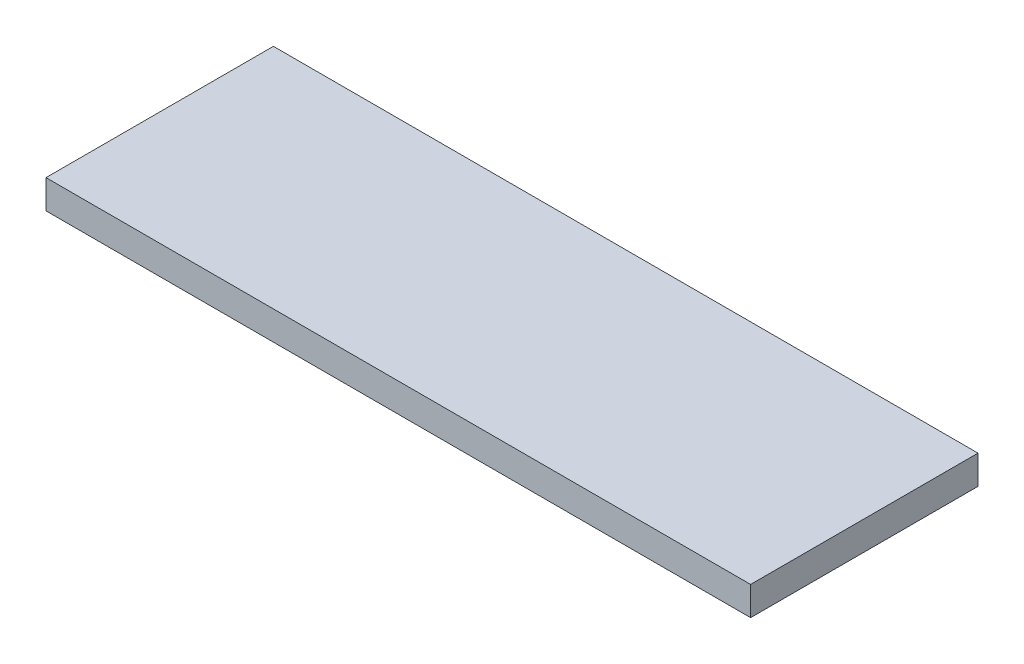
ISO-10303-21;
HEADER;
FILE_DESCRIPTION(('STEP AP214'),'2;1');
FILE_NAME('part.step','',(''),(''),'','','');
FILE_SCHEMA(('AUTOMOTIVE_DESIGN { 1 0 10303 214 1 1 1 1 }'));
ENDSEC;
DATA;
#1=APPLICATION_CONTEXT('core data for automotive mechanical design processes');
#2=APPLICATION_PROTOCOL_DEFINITION('international standard','automotive_design',2000,#1);
#3=PRODUCT_CONTEXT('',#1,'mechanical');
#4=PRODUCT('Part','Part','',(#3));
#5=PRODUCT_RELATED_PRODUCT_CATEGORY('part','',(#4));
#6=PRODUCT_DEFINITION_FORMATION('','',#4);
#7=PRODUCT_DEFINITION_CONTEXT('part definition',#1,'design');
#8=PRODUCT_DEFINITION('design','',#6,#7);
#9=PRODUCT_DEFINITION_SHAPE('','',#8);
#10=(LENGTH_UNIT() NAMED_UNIT(*) SI_UNIT(.MILLI.,.METRE.));
#11=(NAMED_UNIT(*) PLANE_ANGLE_UNIT() SI_UNIT($,.RADIAN.));
#12=(NAMED_UNIT(*) SI_UNIT($,.STERADIAN.) SOLID_ANGLE_UNIT());
#13=UNCERTAINTY_MEASURE_WITH_UNIT(LENGTH_MEASURE(1.E-05),#10,'distance_accuracy_value','');
#14=(GEOMETRIC_REPRESENTATION_CONTEXT(3) GLOBAL_UNCERTAINTY_ASSIGNED_CONTEXT((#13)) GLOBAL_UNIT_ASSIGNED_CONTEXT((#10,
#11,#12)) REPRESENTATION_CONTEXT('',''));
#15=CARTESIAN_POINT('',(0.,0.,0.));
#16=DIRECTION('',(0.,0.,1.));
#17=DIRECTION('',(1.,0.,0.));
#18=AXIS2_PLACEMENT_3D('',#15,#16,#17);
#19=CARTESIAN_POINT('',(-209.691785571005,19.,-60.9102337228714));
#20=DIRECTION('',(1.,0.,0.));
#21=DIRECTION('',(0.,0.,-1.));
#22=AXIS2_PLACEMENT_3D('',#19,#20,#21);
#23=PLANE('',#22);
#24=DIRECTION('',(0.,0.,1.));
#25=VECTOR('',#24,1.);
#26=CARTESIAN_POINT('',(-209.691785571005,0.,-60.9102337228714));
#27=LINE('',#26,#25);
#28=CARTESIAN_POINT('',(-209.691785571005,0.,-60.9102337228714));
#29=VERTEX_POINT('',#28);
#30=CARTESIAN_POINT('',(-209.691785571005,0.,89.0897662771286));
#31=VERTEX_POINT('',#30);
#32=EDGE_CURVE('E96',#29,#31,#27,.T.);
#33=ORIENTED_EDGE('',*,*,#32,.T.);
#34=DIRECTION('',(0.,-1.,0.));
#35=VECTOR('',#34,1.);
#36=CARTESIAN_POINT('',(-209.691785571005,19.,89.0897662771286));
#37=LINE('',#36,#35);
#38=CARTESIAN_POINT('',(-209.691785571005,19.,89.0897662771286));
#39=VERTEX_POINT('',#38);
#40=EDGE_CURVE('E11',#39,#31,#37,.T.);
#41=ORIENTED_EDGE('',*,*,#40,.F.);
#42=DIRECTION('',(0.,0.,1.));
#43=VECTOR('',#42,1.);
#44=CARTESIAN_POINT('',(-209.691785571005,19.,-60.9102337228714));
#45=LINE('',#44,#43);
#46=CARTESIAN_POINT('',(-209.691785571005,19.,-60.9102337228714));
#47=VERTEX_POINT('',#46);
#48=EDGE_CURVE('E84',#47,#39,#45,.T.);
#49=ORIENTED_EDGE('',*,*,#48,.F.);
#50=DIRECTION('',(0.,-1.,0.));
#51=VECTOR('',#50,1.);
#52=CARTESIAN_POINT('',(-209.691785571005,19.,-60.9102337228714));
#53=LINE('',#52,#51);
#54=EDGE_CURVE('E92',#47,#29,#53,.T.);
#55=ORIENTED_EDGE('',*,*,#54,.T.);
#56=EDGE_LOOP('',(#33,#41,#49,#55));
#57=FACE_BOUND('',#56,.T.);
#58=ADVANCED_FACE('F33',(#57),#23,.F.);
#59=CARTESIAN_POINT('',(-209.691785571005,19.,89.0897662771286));
#60=DIRECTION('',(0.,0.,-1.));
#61=DIRECTION('',(-1.,0.,0.));
#62=AXIS2_PLACEMENT_3D('',#59,#60,#61);
#63=PLANE('',#62);
#64=DIRECTION('',(1.,0.,0.));
#65=VECTOR('',#64,1.);
#66=CARTESIAN_POINT('',(-209.691785571005,0.,89.0897662771286));
#67=LINE('',#66,#65);
#68=CARTESIAN_POINT('',(255.088214428995,0.,89.0897662771286));
#69=VERTEX_POINT('',#68);
#70=EDGE_CURVE('E88',#31,#69,#67,.T.);
#71=ORIENTED_EDGE('',*,*,#70,.T.);
#72=DIRECTION('',(0.,-1.,0.));
#73=VECTOR('',#72,1.);
#74=CARTESIAN_POINT('',(255.088214428995,19.,89.0897662771286));
#75=LINE('',#74,#73);
#76=CARTESIAN_POINT('',(255.088214428995,19.,89.0897662771286));
#77=VERTEX_POINT('',#76);
#78=EDGE_CURVE('E41',#77,#69,#75,.T.);
#79=ORIENTED_EDGE('',*,*,#78,.F.);
#80=DIRECTION('',(1.,0.,0.));
#81=VECTOR('',#80,1.);
#82=CARTESIAN_POINT('',(-209.691785571005,19.,89.0897662771286));
#83=LINE('',#82,#81);
#84=EDGE_CURVE('E79',#39,#77,#83,.T.);
#85=ORIENTED_EDGE('',*,*,#84,.F.);
#86=ORIENTED_EDGE('',*,*,#40,.T.);
#87=EDGE_LOOP('',(#71,#79,#85,#86));
#88=FACE_BOUND('',#87,.T.);
#89=ADVANCED_FACE('F87',(#88),#63,.F.);
#90=CARTESIAN_POINT('',(255.088214428995,19.,-60.9102337228714));
#91=DIRECTION('',(-1.,0.,0.));
#92=DIRECTION('',(0.,0.,1.));
#93=AXIS2_PLACEMENT_3D('',#90,#91,#92);
#94=PLANE('',#93);
#95=DIRECTION('',(0.,0.,-1.));
#96=VECTOR('',#95,1.);
#97=CARTESIAN_POINT('',(255.088214428995,0.,-60.9102337228714));
#98=LINE('',#97,#96);
#99=CARTESIAN_POINT('',(255.088214428995,0.,-60.9102337228714));
#100=VERTEX_POINT('',#99);
#101=EDGE_CURVE('E66',#69,#100,#98,.T.);
#102=ORIENTED_EDGE('',*,*,#101,.T.);
#103=DIRECTION('',(0.,-1.,0.));
#104=VECTOR('',#103,1.);
#105=CARTESIAN_POINT('',(255.088214428995,19.,-60.9102337228714));
#106=LINE('',#105,#104);
#107=CARTESIAN_POINT('',(255.088214428995,19.,-60.9102337228714));
#108=VERTEX_POINT('',#107);
#109=EDGE_CURVE('E89',#108,#100,#106,.T.);
#110=ORIENTED_EDGE('',*,*,#109,.F.);
#111=DIRECTION('',(0.,0.,-1.));
#112=VECTOR('',#111,1.);
#113=CARTESIAN_POINT('',(255.088214428995,19.,-60.9102337228714));
#114=LINE('',#113,#112);
#115=EDGE_CURVE('E82',#77,#108,#114,.T.);
#116=ORIENTED_EDGE('',*,*,#115,.F.);
#117=ORIENTED_EDGE('',*,*,#78,.T.);
#118=EDGE_LOOP('',(#102,#110,#116,#117));
#119=FACE_BOUND('',#118,.T.);
#120=ADVANCED_FACE('F90',(#119),#94,.F.);
#121=CARTESIAN_POINT('',(-209.691785571005,19.,-60.9102337228714));
#122=DIRECTION('',(0.,0.,1.));
#123=DIRECTION('',(1.,0.,0.));
#124=AXIS2_PLACEMENT_3D('',#121,#122,#123);
#125=PLANE('',#124);
#126=DIRECTION('',(-1.,0.,0.));
#127=VECTOR('',#126,1.);
#128=CARTESIAN_POINT('',(-209.691785571005,0.,-60.9102337228714));
#129=LINE('',#128,#127);
#130=EDGE_CURVE('E72',#100,#29,#129,.T.);
#131=ORIENTED_EDGE('',*,*,#130,.T.);
#132=ORIENTED_EDGE('',*,*,#54,.F.);
#133=DIRECTION('',(-1.,0.,0.));
#134=VECTOR('',#133,1.);
#135=CARTESIAN_POINT('',(-209.691785571005,19.,-60.9102337228714));
#136=LINE('',#135,#134);
#137=EDGE_CURVE('E49',#108,#47,#136,.T.);
#138=ORIENTED_EDGE('',*,*,#137,.F.);
#139=ORIENTED_EDGE('',*,*,#109,.T.);
#140=EDGE_LOOP('',(#131,#132,#138,#139));
#141=FACE_BOUND('',#140,.T.);
#142=ADVANCED_FACE('F103',(#141),#125,.F.);
#143=CARTESIAN_POINT('',(0.,19.,0.));
#144=DIRECTION('',(0.,1.,0.));
#145=DIRECTION('',(0.,0.,1.));
#146=AXIS2_PLACEMENT_3D('',#143,#144,#145);
#147=PLANE('',#146);
#148=ORIENTED_EDGE('',*,*,#48,.T.);
#149=ORIENTED_EDGE('',*,*,#84,.T.);
#150=ORIENTED_EDGE('',*,*,#115,.T.);
#151=ORIENTED_EDGE('',*,*,#137,.T.);
#152=EDGE_LOOP('',(#148,#149,#150,#151));
#153=FACE_BOUND('',#152,.T.);
#154=ADVANCED_FACE('F80',(#153),#147,.T.);
#155=CARTESIAN_POINT('',(0.,0.,0.));
#156=DIRECTION('',(0.,1.,0.));
#157=DIRECTION('',(0.,0.,1.));
#158=AXIS2_PLACEMENT_3D('',#155,#156,#157);
#159=PLANE('',#158);
#160=ORIENTED_EDGE('',*,*,#32,.F.);
#161=ORIENTED_EDGE('',*,*,#130,.F.);
#162=ORIENTED_EDGE('',*,*,#101,.F.);
#163=ORIENTED_EDGE('',*,*,#70,.F.);
#164=EDGE_LOOP('',(#160,#161,#162,#163));
#165=FACE_BOUND('',#164,.T.);
#166=ADVANCED_FACE('F106',(#165),#159,.F.);
#167=CLOSED_SHELL('',(#58,#89,#120,#142,#154,#166));
#168=MANIFOLD_SOLID_BREP('B2',#167);
#169=ADVANCED_BREP_SHAPE_REPRESENTATION('',(#18,#168),#14);
#170=SHAPE_DEFINITION_REPRESENTATION(#9,#169);
ENDSEC;
END-ISO-10303-21;
